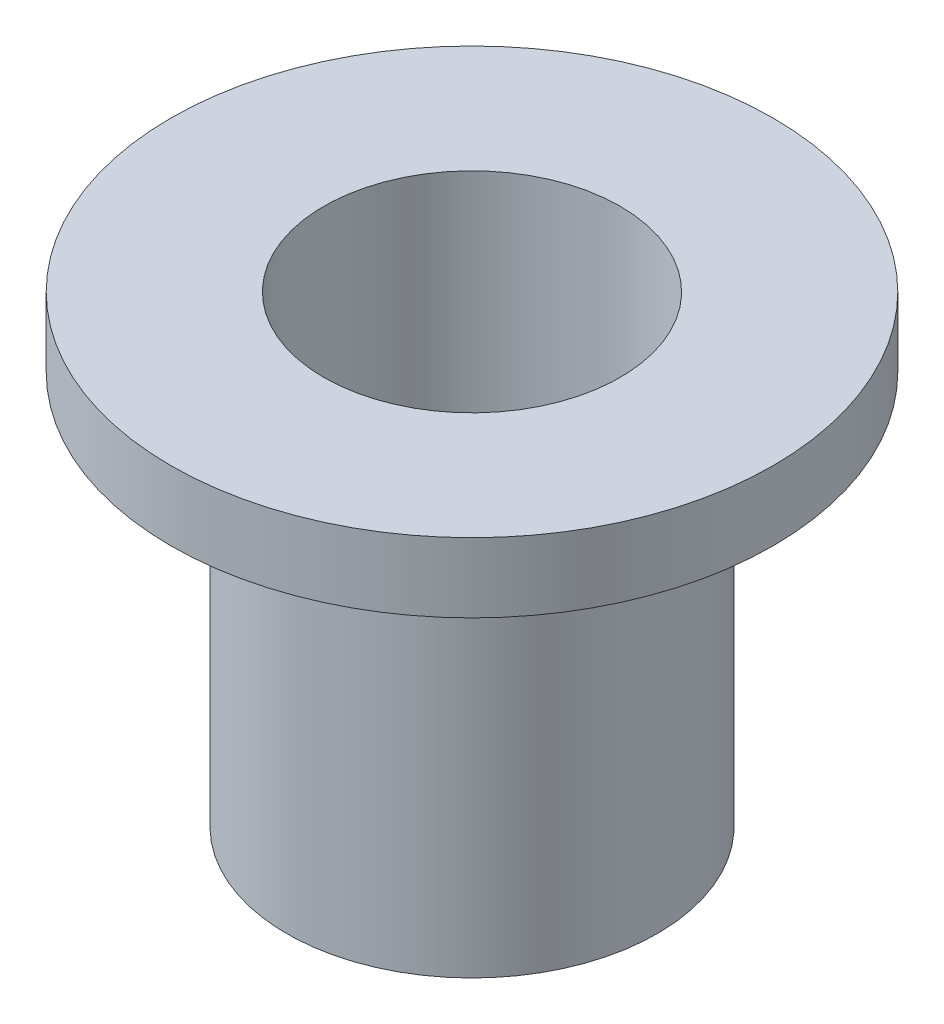
ISO-10303-21;
HEADER;
FILE_DESCRIPTION(('STEP AP214'),'2;1');
FILE_NAME('part.step','',(''),(''),'','','');
FILE_SCHEMA(('AUTOMOTIVE_DESIGN { 1 0 10303 214 1 1 1 1 }'));
ENDSEC;
DATA;
#1=APPLICATION_CONTEXT('core data for automotive mechanical design processes');
#2=APPLICATION_PROTOCOL_DEFINITION('international standard','automotive_design',2000,#1);
#3=PRODUCT_CONTEXT('',#1,'mechanical');
#4=PRODUCT('Part','Part','',(#3));
#5=PRODUCT_RELATED_PRODUCT_CATEGORY('part','',(#4));
#6=PRODUCT_DEFINITION_FORMATION('','',#4);
#7=PRODUCT_DEFINITION_CONTEXT('part definition',#1,'design');
#8=PRODUCT_DEFINITION('design','',#6,#7);
#9=PRODUCT_DEFINITION_SHAPE('','',#8);
#10=(LENGTH_UNIT() NAMED_UNIT(*) SI_UNIT(.MILLI.,.METRE.));
#11=(NAMED_UNIT(*) PLANE_ANGLE_UNIT() SI_UNIT($,.RADIAN.));
#12=(NAMED_UNIT(*) SI_UNIT($,.STERADIAN.) SOLID_ANGLE_UNIT());
#13=UNCERTAINTY_MEASURE_WITH_UNIT(LENGTH_MEASURE(1.E-05),#10,'distance_accuracy_value','');
#14=(GEOMETRIC_REPRESENTATION_CONTEXT(3) GLOBAL_UNCERTAINTY_ASSIGNED_CONTEXT((#13)) GLOBAL_UNIT_ASSIGNED_CONTEXT((#10,
#11,#12)) REPRESENTATION_CONTEXT('',''));
#15=CARTESIAN_POINT('',(0.,0.,0.));
#16=DIRECTION('',(0.,0.,1.));
#17=DIRECTION('',(1.,0.,0.));
#18=AXIS2_PLACEMENT_3D('',#15,#16,#17);
#19=CARTESIAN_POINT('',(0.,0.,3.2));
#20=DIRECTION('',(0.,1.,0.));
#21=DIRECTION('',(0.,0.,1.));
#22=AXIS2_PLACEMENT_3D('',#19,#20,#21);
#23=PLANE('',#22);
#24=CARTESIAN_POINT('',(0.,0.,0.));
#25=DIRECTION('',(0.,-1.,0.));
#26=DIRECTION('',(0.,0.,-1.));
#27=AXIS2_PLACEMENT_3D('',#24,#25,#26);
#28=CIRCLE('',#27,3.2);
#29=CARTESIAN_POINT('',(0.,0.,-3.2));
#30=VERTEX_POINT('',#29);
#31=EDGE_CURVE('E10',#30,#30,#28,.T.);
#32=ORIENTED_EDGE('',*,*,#31,.F.);
#33=EDGE_LOOP('',(#32));
#34=FACE_BOUND('',#33,.T.);
#35=CARTESIAN_POINT('',(0.,0.,0.));
#36=DIRECTION('',(0.,-1.,0.));
#37=DIRECTION('',(0.,0.,-1.));
#38=AXIS2_PLACEMENT_3D('',#35,#36,#37);
#39=CIRCLE('',#38,4.);
#40=CARTESIAN_POINT('',(0.,0.,-4.));
#41=VERTEX_POINT('',#40);
#42=EDGE_CURVE('E54',#41,#41,#39,.T.);
#43=ORIENTED_EDGE('',*,*,#42,.T.);
#44=EDGE_LOOP('',(#43));
#45=FACE_BOUND('',#44,.T.);
#46=ADVANCED_FACE('F32',(#34,#45),#23,.F.);
#47=CARTESIAN_POINT('',(0.,-11.9884685294749,0.));
#48=DIRECTION('',(0.,-1.,0.));
#49=DIRECTION('',(0.,0.,-1.));
#50=AXIS2_PLACEMENT_3D('',#47,#48,#49);
#51=CYLINDRICAL_SURFACE('',#50,3.2);
#52=CARTESIAN_POINT('',(0.,10.,0.));
#53=DIRECTION('',(0.,-1.,0.));
#54=DIRECTION('',(0.,0.,-1.));
#55=AXIS2_PLACEMENT_3D('',#52,#53,#54);
#56=CIRCLE('',#55,3.2);
#57=CARTESIAN_POINT('',(0.,10.,-3.2));
#58=VERTEX_POINT('',#57);
#59=EDGE_CURVE('E38',#58,#58,#56,.T.);
#60=ORIENTED_EDGE('',*,*,#59,.F.);
#61=EDGE_LOOP('',(#60));
#62=FACE_BOUND('',#61,.T.);
#63=ORIENTED_EDGE('',*,*,#31,.T.);
#64=EDGE_LOOP('',(#63));
#65=FACE_BOUND('',#64,.T.);
#66=ADVANCED_FACE('F79',(#62,#65),#51,.F.);
#67=CARTESIAN_POINT('',(0.,10.,3.2));
#68=DIRECTION('',(0.,-1.,0.));
#69=DIRECTION('',(0.,0.,-1.));
#70=AXIS2_PLACEMENT_3D('',#67,#68,#69);
#71=PLANE('',#70);
#72=CARTESIAN_POINT('',(0.,10.,0.));
#73=DIRECTION('',(0.,-1.,0.));
#74=DIRECTION('',(0.,0.,-1.));
#75=AXIS2_PLACEMENT_3D('',#72,#73,#74);
#76=CIRCLE('',#75,6.5);
#77=CARTESIAN_POINT('',(0.,10.,-6.5));
#78=VERTEX_POINT('',#77);
#79=EDGE_CURVE('E42',#78,#78,#76,.T.);
#80=ORIENTED_EDGE('',*,*,#79,.F.);
#81=EDGE_LOOP('',(#80));
#82=FACE_BOUND('',#81,.T.);
#83=ORIENTED_EDGE('',*,*,#59,.T.);
#84=EDGE_LOOP('',(#83));
#85=FACE_BOUND('',#84,.T.);
#86=ADVANCED_FACE('F74',(#82,#85),#71,.F.);
#87=CARTESIAN_POINT('',(0.,-11.9884685294749,0.));
#88=DIRECTION('',(0.,-1.,0.));
#89=DIRECTION('',(0.,0.,-1.));
#90=AXIS2_PLACEMENT_3D('',#87,#88,#89);
#91=CYLINDRICAL_SURFACE('',#90,6.5);
#92=CARTESIAN_POINT('',(0.,8.5,0.));
#93=DIRECTION('',(0.,-1.,0.));
#94=DIRECTION('',(0.,0.,-1.));
#95=AXIS2_PLACEMENT_3D('',#92,#93,#94);
#96=CIRCLE('',#95,6.5);
#97=CARTESIAN_POINT('',(0.,8.5,-6.5));
#98=VERTEX_POINT('',#97);
#99=EDGE_CURVE('E46',#98,#98,#96,.T.);
#100=ORIENTED_EDGE('',*,*,#99,.F.);
#101=EDGE_LOOP('',(#100));
#102=FACE_BOUND('',#101,.T.);
#103=ORIENTED_EDGE('',*,*,#79,.T.);
#104=EDGE_LOOP('',(#103));
#105=FACE_BOUND('',#104,.T.);
#106=ADVANCED_FACE('F68',(#102,#105),#91,.T.);
#107=CARTESIAN_POINT('',(0.,8.5,6.5));
#108=DIRECTION('',(0.,1.,0.));
#109=DIRECTION('',(0.,0.,1.));
#110=AXIS2_PLACEMENT_3D('',#107,#108,#109);
#111=PLANE('',#110);
#112=CARTESIAN_POINT('',(0.,8.5,0.));
#113=DIRECTION('',(0.,-1.,0.));
#114=DIRECTION('',(0.,0.,-1.));
#115=AXIS2_PLACEMENT_3D('',#112,#113,#114);
#116=CIRCLE('',#115,4.);
#117=CARTESIAN_POINT('',(0.,8.5,-4.));
#118=VERTEX_POINT('',#117);
#119=EDGE_CURVE('E51',#118,#118,#116,.T.);
#120=ORIENTED_EDGE('',*,*,#119,.F.);
#121=EDGE_LOOP('',(#120));
#122=FACE_BOUND('',#121,.T.);
#123=ORIENTED_EDGE('',*,*,#99,.T.);
#124=EDGE_LOOP('',(#123));
#125=FACE_BOUND('',#124,.T.);
#126=ADVANCED_FACE('F62',(#122,#125),#111,.F.);
#127=CARTESIAN_POINT('',(0.,-11.9884685294749,0.));
#128=DIRECTION('',(0.,-1.,0.));
#129=DIRECTION('',(0.,0.,-1.));
#130=AXIS2_PLACEMENT_3D('',#127,#128,#129);
#131=CYLINDRICAL_SURFACE('',#130,4.);
#132=ORIENTED_EDGE('',*,*,#42,.F.);
#133=EDGE_LOOP('',(#132));
#134=FACE_BOUND('',#133,.T.);
#135=ORIENTED_EDGE('',*,*,#119,.T.);
#136=EDGE_LOOP('',(#135));
#137=FACE_BOUND('',#136,.T.);
#138=ADVANCED_FACE('F59',(#134,#137),#131,.T.);
#139=CLOSED_SHELL('',(#46,#66,#86,#106,#126,#138));
#140=MANIFOLD_SOLID_BREP('B2',#139);
#141=ADVANCED_BREP_SHAPE_REPRESENTATION('',(#18,#140),#14);
#142=SHAPE_DEFINITION_REPRESENTATION(#9,#141);
ENDSEC;
END-ISO-10303-21;
